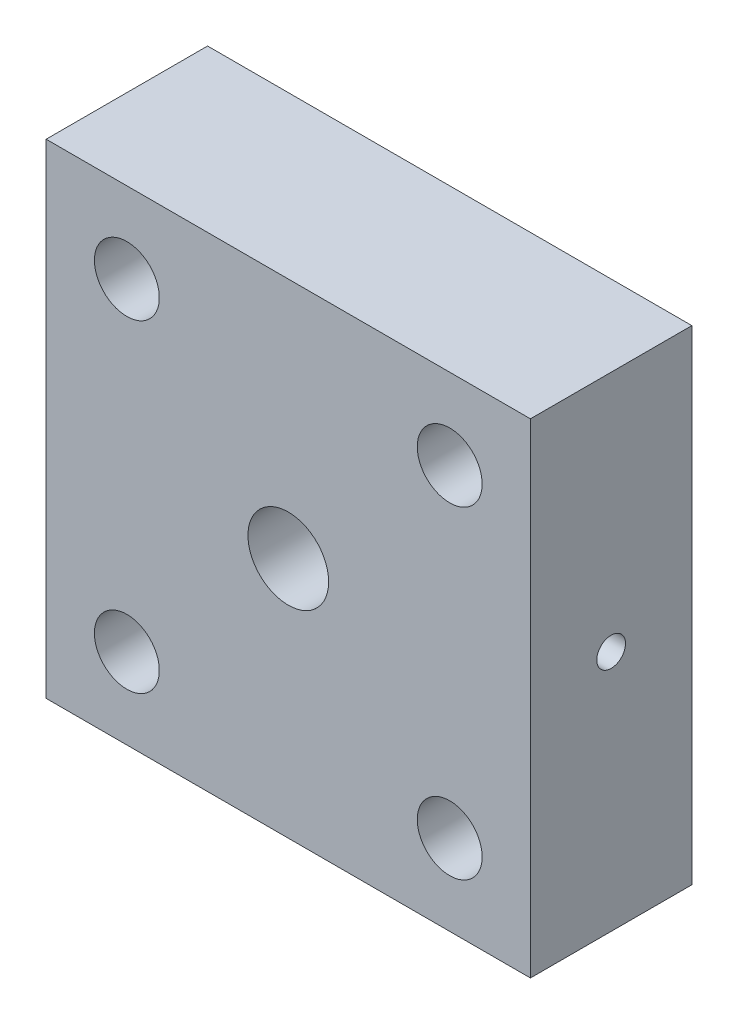
ISO-10303-21;
HEADER;
FILE_DESCRIPTION(('STEP AP214'),'2;1');
FILE_NAME('part.step','',(''),(''),'','','');
FILE_SCHEMA(('AUTOMOTIVE_DESIGN { 1 0 10303 214 1 1 1 1 }'));
ENDSEC;
DATA;
#1=APPLICATION_CONTEXT('core data for automotive mechanical design processes');
#2=APPLICATION_PROTOCOL_DEFINITION('international standard','automotive_design',2000,#1);
#3=PRODUCT_CONTEXT('',#1,'mechanical');
#4=PRODUCT('Part','Part','',(#3));
#5=PRODUCT_RELATED_PRODUCT_CATEGORY('part','',(#4));
#6=PRODUCT_DEFINITION_FORMATION('','',#4);
#7=PRODUCT_DEFINITION_CONTEXT('part definition',#1,'design');
#8=PRODUCT_DEFINITION('design','',#6,#7);
#9=PRODUCT_DEFINITION_SHAPE('','',#8);
#10=(LENGTH_UNIT() NAMED_UNIT(*) SI_UNIT(.MILLI.,.METRE.));
#11=(NAMED_UNIT(*) PLANE_ANGLE_UNIT() SI_UNIT($,.RADIAN.));
#12=(NAMED_UNIT(*) SI_UNIT($,.STERADIAN.) SOLID_ANGLE_UNIT());
#13=UNCERTAINTY_MEASURE_WITH_UNIT(LENGTH_MEASURE(1.E-05),#10,'distance_accuracy_value','');
#14=(GEOMETRIC_REPRESENTATION_CONTEXT(3) GLOBAL_UNCERTAINTY_ASSIGNED_CONTEXT((#13)) GLOBAL_UNIT_ASSIGNED_CONTEXT((#10,
#11,#12)) REPRESENTATION_CONTEXT('',''));
#15=CARTESIAN_POINT('',(0.,0.,0.));
#16=DIRECTION('',(0.,0.,1.));
#17=DIRECTION('',(1.,0.,0.));
#18=AXIS2_PLACEMENT_3D('',#15,#16,#17);
#19=CARTESIAN_POINT('',(0.,0.,12.7));
#20=DIRECTION('',(0.,0.,-1.));
#21=DIRECTION('',(-1.,0.,0.));
#22=AXIS2_PLACEMENT_3D('',#19,#20,#21);
#23=PLANE('',#22);
#24=CARTESIAN_POINT('',(12.7,12.7,12.7));
#25=DIRECTION('',(0.,0.,-1.));
#26=DIRECTION('',(-1.,0.,0.));
#27=AXIS2_PLACEMENT_3D('',#24,#25,#26);
#28=CIRCLE('',#27,2.5527);
#29=CARTESIAN_POINT('',(10.1473,12.7,12.7));
#30=VERTEX_POINT('',#29);
#31=EDGE_CURVE('E268',#30,#30,#28,.T.);
#32=ORIENTED_EDGE('',*,*,#31,.T.);
#33=EDGE_LOOP('',(#32));
#34=FACE_BOUND('',#33,.T.);
#35=CARTESIAN_POINT('',(-12.7,12.7,12.7));
#36=DIRECTION('',(0.,0.,-1.));
#37=DIRECTION('',(-1.,0.,0.));
#38=AXIS2_PLACEMENT_3D('',#35,#36,#37);
#39=CIRCLE('',#38,2.5527);
#40=CARTESIAN_POINT('',(-15.2527,12.7,12.7));
#41=VERTEX_POINT('',#40);
#42=EDGE_CURVE('E262',#41,#41,#39,.T.);
#43=ORIENTED_EDGE('',*,*,#42,.T.);
#44=EDGE_LOOP('',(#43));
#45=FACE_BOUND('',#44,.T.);
#46=CARTESIAN_POINT('',(-12.7,-12.7,12.7));
#47=DIRECTION('',(0.,0.,-1.));
#48=DIRECTION('',(-1.,0.,0.));
#49=AXIS2_PLACEMENT_3D('',#46,#47,#48);
#50=CIRCLE('',#49,2.5527);
#51=CARTESIAN_POINT('',(-15.2527,-12.7,12.7));
#52=VERTEX_POINT('',#51);
#53=EDGE_CURVE('E254',#52,#52,#50,.T.);
#54=ORIENTED_EDGE('',*,*,#53,.T.);
#55=EDGE_LOOP('',(#54));
#56=FACE_BOUND('',#55,.T.);
#57=CARTESIAN_POINT('',(12.7,-12.7,12.7));
#58=DIRECTION('',(0.,0.,-1.));
#59=DIRECTION('',(-1.,0.,0.));
#60=AXIS2_PLACEMENT_3D('',#57,#58,#59);
#61=CIRCLE('',#60,2.5527);
#62=CARTESIAN_POINT('',(10.1473,-12.7,12.7));
#63=VERTEX_POINT('',#62);
#64=EDGE_CURVE('E248',#63,#63,#61,.T.);
#65=ORIENTED_EDGE('',*,*,#64,.T.);
#66=EDGE_LOOP('',(#65));
#67=FACE_BOUND('',#66,.T.);
#68=DIRECTION('',(0.,-1.,0.));
#69=VECTOR('',#68,1.);
#70=CARTESIAN_POINT('',(-19.05,-19.05,12.7));
#71=LINE('',#70,#69);
#72=CARTESIAN_POINT('',(-19.05,19.05,12.7));
#73=VERTEX_POINT('',#72);
#74=CARTESIAN_POINT('',(-19.05,-19.05,12.7));
#75=VERTEX_POINT('',#74);
#76=EDGE_CURVE('E85',#73,#75,#71,.T.);
#77=ORIENTED_EDGE('',*,*,#76,.T.);
#78=DIRECTION('',(1.,0.,0.));
#79=VECTOR('',#78,1.);
#80=CARTESIAN_POINT('',(-19.05,-19.05,12.7));
#81=LINE('',#80,#79);
#82=CARTESIAN_POINT('',(19.05,-19.05,12.7));
#83=VERTEX_POINT('',#82);
#84=EDGE_CURVE('E80',#75,#83,#81,.T.);
#85=ORIENTED_EDGE('',*,*,#84,.T.);
#86=DIRECTION('',(0.,1.,0.));
#87=VECTOR('',#86,1.);
#88=CARTESIAN_POINT('',(19.05,-19.05,12.7));
#89=LINE('',#88,#87);
#90=CARTESIAN_POINT('',(19.05,19.05,12.7));
#91=VERTEX_POINT('',#90);
#92=EDGE_CURVE('E83',#83,#91,#89,.T.);
#93=ORIENTED_EDGE('',*,*,#92,.T.);
#94=DIRECTION('',(-1.,0.,0.));
#95=VECTOR('',#94,1.);
#96=CARTESIAN_POINT('',(-19.05,19.05,12.7));
#97=LINE('',#96,#95);
#98=EDGE_CURVE('E50',#91,#73,#97,.T.);
#99=ORIENTED_EDGE('',*,*,#98,.T.);
#100=EDGE_LOOP('',(#77,#85,#93,#99));
#101=FACE_BOUND('',#100,.T.);
#102=CARTESIAN_POINT('',(0.,0.,12.7));
#103=DIRECTION('',(0.,0.,1.));
#104=DIRECTION('',(1.,0.,0.));
#105=AXIS2_PLACEMENT_3D('',#102,#103,#104);
#106=CIRCLE('',#105,3.175);
#107=CARTESIAN_POINT('',(3.175,0.,12.7));
#108=VERTEX_POINT('',#107);
#109=EDGE_CURVE('E100',#108,#108,#106,.T.);
#110=ORIENTED_EDGE('',*,*,#109,.F.);
#111=EDGE_LOOP('',(#110));
#112=FACE_BOUND('',#111,.T.);
#113=ADVANCED_FACE('F33',(#34,#45,#56,#67,#101,#112),#23,.F.);
#114=CARTESIAN_POINT('',(0.,0.,0.));
#115=DIRECTION('',(0.,0.,-1.));
#116=DIRECTION('',(-1.,0.,0.));
#117=AXIS2_PLACEMENT_3D('',#114,#115,#116);
#118=PLANE('',#117);
#119=CARTESIAN_POINT('',(12.7,12.7,0.));
#120=DIRECTION('',(0.,0.,-1.));
#121=DIRECTION('',(-1.,0.,0.));
#122=AXIS2_PLACEMENT_3D('',#119,#120,#121);
#123=CIRCLE('',#122,2.5527);
#124=CARTESIAN_POINT('',(10.1473,12.7,0.));
#125=VERTEX_POINT('',#124);
#126=EDGE_CURVE('E270',#125,#125,#123,.T.);
#127=ORIENTED_EDGE('',*,*,#126,.F.);
#128=EDGE_LOOP('',(#127));
#129=FACE_BOUND('',#128,.T.);
#130=CARTESIAN_POINT('',(-12.7,12.7,0.));
#131=DIRECTION('',(0.,0.,-1.));
#132=DIRECTION('',(-1.,0.,0.));
#133=AXIS2_PLACEMENT_3D('',#130,#131,#132);
#134=CIRCLE('',#133,2.5527);
#135=CARTESIAN_POINT('',(-15.2527,12.7,0.));
#136=VERTEX_POINT('',#135);
#137=EDGE_CURVE('E265',#136,#136,#134,.T.);
#138=ORIENTED_EDGE('',*,*,#137,.F.);
#139=EDGE_LOOP('',(#138));
#140=FACE_BOUND('',#139,.T.);
#141=CARTESIAN_POINT('',(-12.7,-12.7,0.));
#142=DIRECTION('',(0.,0.,-1.));
#143=DIRECTION('',(-1.,0.,0.));
#144=AXIS2_PLACEMENT_3D('',#141,#142,#143);
#145=CIRCLE('',#144,2.5527);
#146=CARTESIAN_POINT('',(-15.2527,-12.7,0.));
#147=VERTEX_POINT('',#146);
#148=EDGE_CURVE('E259',#147,#147,#145,.T.);
#149=ORIENTED_EDGE('',*,*,#148,.F.);
#150=EDGE_LOOP('',(#149));
#151=FACE_BOUND('',#150,.T.);
#152=CARTESIAN_POINT('',(12.7,-12.7,0.));
#153=DIRECTION('',(0.,0.,-1.));
#154=DIRECTION('',(-1.,0.,0.));
#155=AXIS2_PLACEMENT_3D('',#152,#153,#154);
#156=CIRCLE('',#155,2.5527);
#157=CARTESIAN_POINT('',(10.1473,-12.7,0.));
#158=VERTEX_POINT('',#157);
#159=EDGE_CURVE('E250',#158,#158,#156,.T.);
#160=ORIENTED_EDGE('',*,*,#159,.F.);
#161=EDGE_LOOP('',(#160));
#162=FACE_BOUND('',#161,.T.);
#163=DIRECTION('',(0.,-1.,0.));
#164=VECTOR('',#163,1.);
#165=CARTESIAN_POINT('',(-19.05,-19.05,0.));
#166=LINE('',#165,#164);
#167=CARTESIAN_POINT('',(-19.05,19.05,0.));
#168=VERTEX_POINT('',#167);
#169=CARTESIAN_POINT('',(-19.05,-19.05,0.));
#170=VERTEX_POINT('',#169);
#171=EDGE_CURVE('E97',#168,#170,#166,.T.);
#172=ORIENTED_EDGE('',*,*,#171,.F.);
#173=DIRECTION('',(-1.,0.,0.));
#174=VECTOR('',#173,1.);
#175=CARTESIAN_POINT('',(-19.05,19.05,0.));
#176=LINE('',#175,#174);
#177=CARTESIAN_POINT('',(19.05,19.05,0.));
#178=VERTEX_POINT('',#177);
#179=EDGE_CURVE('E73',#178,#168,#176,.T.);
#180=ORIENTED_EDGE('',*,*,#179,.F.);
#181=DIRECTION('',(0.,1.,0.));
#182=VECTOR('',#181,1.);
#183=CARTESIAN_POINT('',(19.05,-19.05,0.));
#184=LINE('',#183,#182);
#185=CARTESIAN_POINT('',(19.05,-19.05,0.));
#186=VERTEX_POINT('',#185);
#187=EDGE_CURVE('E67',#186,#178,#184,.T.);
#188=ORIENTED_EDGE('',*,*,#187,.F.);
#189=DIRECTION('',(1.,0.,0.));
#190=VECTOR('',#189,1.);
#191=CARTESIAN_POINT('',(-19.05,-19.05,0.));
#192=LINE('',#191,#190);
#193=EDGE_CURVE('E89',#170,#186,#192,.T.);
#194=ORIENTED_EDGE('',*,*,#193,.F.);
#195=EDGE_LOOP('',(#172,#180,#188,#194));
#196=FACE_BOUND('',#195,.T.);
#197=CARTESIAN_POINT('',(0.,0.,0.));
#198=DIRECTION('',(0.,0.,1.));
#199=DIRECTION('',(1.,0.,0.));
#200=AXIS2_PLACEMENT_3D('',#197,#198,#199);
#201=CIRCLE('',#200,3.175);
#202=CARTESIAN_POINT('',(3.175,0.,0.));
#203=VERTEX_POINT('',#202);
#204=EDGE_CURVE('E112',#203,#203,#201,.T.);
#205=ORIENTED_EDGE('',*,*,#204,.T.);
#206=EDGE_LOOP('',(#205));
#207=FACE_BOUND('',#206,.T.);
#208=ADVANCED_FACE('F108',(#129,#140,#151,#162,#196,#207),#118,.T.);
#209=CARTESIAN_POINT('',(-19.05,-19.05,12.7));
#210=DIRECTION('',(1.,0.,0.));
#211=DIRECTION('',(0.,1.,0.));
#212=AXIS2_PLACEMENT_3D('',#209,#210,#211);
#213=PLANE('',#212);
#214=ORIENTED_EDGE('',*,*,#171,.T.);
#215=DIRECTION('',(0.,0.,-1.));
#216=VECTOR('',#215,1.);
#217=CARTESIAN_POINT('',(-19.05,-19.05,12.7));
#218=LINE('',#217,#216);
#219=EDGE_CURVE('E11',#75,#170,#218,.T.);
#220=ORIENTED_EDGE('',*,*,#219,.F.);
#221=ORIENTED_EDGE('',*,*,#76,.F.);
#222=DIRECTION('',(0.,0.,-1.));
#223=VECTOR('',#222,1.);
#224=CARTESIAN_POINT('',(-19.05,19.05,12.7));
#225=LINE('',#224,#223);
#226=EDGE_CURVE('E93',#73,#168,#225,.T.);
#227=ORIENTED_EDGE('',*,*,#226,.T.);
#228=EDGE_LOOP('',(#214,#220,#221,#227));
#229=FACE_BOUND('',#228,.T.);
#230=ADVANCED_FACE('F35',(#229),#213,.F.);
#231=CARTESIAN_POINT('',(-19.05,-19.05,12.7));
#232=DIRECTION('',(0.,1.,0.));
#233=DIRECTION('',(0.,0.,1.));
#234=AXIS2_PLACEMENT_3D('',#231,#232,#233);
#235=PLANE('',#234);
#236=ORIENTED_EDGE('',*,*,#193,.T.);
#237=DIRECTION('',(0.,0.,-1.));
#238=VECTOR('',#237,1.);
#239=CARTESIAN_POINT('',(19.05,-19.05,12.7));
#240=LINE('',#239,#238);
#241=EDGE_CURVE('E42',#83,#186,#240,.T.);
#242=ORIENTED_EDGE('',*,*,#241,.F.);
#243=ORIENTED_EDGE('',*,*,#84,.F.);
#244=ORIENTED_EDGE('',*,*,#219,.T.);
#245=EDGE_LOOP('',(#236,#242,#243,#244));
#246=FACE_BOUND('',#245,.T.);
#247=ADVANCED_FACE('F88',(#246),#235,.F.);
#248=CARTESIAN_POINT('',(19.05,-19.05,12.7));
#249=DIRECTION('',(-1.,0.,0.));
#250=DIRECTION('',(0.,-1.,0.));
#251=AXIS2_PLACEMENT_3D('',#248,#249,#250);
#252=PLANE('',#251);
#253=CARTESIAN_POINT('',(19.05,0.,6.35));
#254=DIRECTION('',(1.,0.,0.));
#255=DIRECTION('',(0.,0.,-1.));
#256=AXIS2_PLACEMENT_3D('',#253,#254,#255);
#257=CIRCLE('',#256,1.13029999999999);
#258=CARTESIAN_POINT('',(19.05,0.,5.21970000000001));
#259=VERTEX_POINT('',#258);
#260=EDGE_CURVE('E124',#259,#259,#257,.T.);
#261=ORIENTED_EDGE('',*,*,#260,.F.);
#262=EDGE_LOOP('',(#261));
#263=FACE_BOUND('',#262,.T.);
#264=ORIENTED_EDGE('',*,*,#187,.T.);
#265=DIRECTION('',(0.,0.,-1.));
#266=VECTOR('',#265,1.);
#267=CARTESIAN_POINT('',(19.05,19.05,12.7));
#268=LINE('',#267,#266);
#269=EDGE_CURVE('E90',#91,#178,#268,.T.);
#270=ORIENTED_EDGE('',*,*,#269,.F.);
#271=ORIENTED_EDGE('',*,*,#92,.F.);
#272=ORIENTED_EDGE('',*,*,#241,.T.);
#273=EDGE_LOOP('',(#264,#270,#271,#272));
#274=FACE_BOUND('',#273,.T.);
#275=ADVANCED_FACE('F91',(#263,#274),#252,.F.);
#276=CARTESIAN_POINT('',(-19.05,19.05,12.7));
#277=DIRECTION('',(0.,-1.,0.));
#278=DIRECTION('',(0.,0.,-1.));
#279=AXIS2_PLACEMENT_3D('',#276,#277,#278);
#280=PLANE('',#279);
#281=ORIENTED_EDGE('',*,*,#179,.T.);
#282=ORIENTED_EDGE('',*,*,#226,.F.);
#283=ORIENTED_EDGE('',*,*,#98,.F.);
#284=ORIENTED_EDGE('',*,*,#269,.T.);
#285=EDGE_LOOP('',(#281,#282,#283,#284));
#286=FACE_BOUND('',#285,.T.);
#287=ADVANCED_FACE('F105',(#286),#280,.F.);
#288=CARTESIAN_POINT('',(0.,0.,12.7));
#289=DIRECTION('',(0.,0.,-1.));
#290=DIRECTION('',(-1.,0.,0.));
#291=AXIS2_PLACEMENT_3D('',#288,#289,#290);
#292=CYLINDRICAL_SURFACE('',#291,3.175);
#293=CARTESIAN_POINT('',(3.175,0.,5.21970000000001));
#294=CARTESIAN_POINT('',(3.17500087649076,-0.0614285544766747,5.21969877624258));
#295=CARTESIAN_POINT('',(3.17320130070143,-0.122848391480884,5.22472367898314));
#296=CARTESIAN_POINT('',(3.1662010034201,-0.243864611742381,5.24461858543575));
#297=CARTESIAN_POINT('',(3.16100038856924,-0.303461052111783,5.25948828045997));
#298=CARTESIAN_POINT('',(3.14775949893737,-0.419068309151042,5.29848844997216));
#299=CARTESIAN_POINT('',(3.13972436624609,-0.475085403185971,5.32260216174167));
#300=CARTESIAN_POINT('',(3.12162393487057,-0.582278041616499,5.37932504012241));
#301=CARTESIAN_POINT('',(3.11155815385673,-0.633452431498646,5.41193622563318));
#302=CARTESIAN_POINT('',(3.09000790855595,-0.731495005230024,5.48605507992649));
#303=CARTESIAN_POINT('',(3.07848610582585,-0.77814961624389,5.52783431689856));
#304=CARTESIAN_POINT('',(3.055516031792,-0.863958107942651,5.61852654130838));
#305=CARTESIAN_POINT('',(3.04406778065305,-0.903110009958683,5.66744140463129));
#306=CARTESIAN_POINT('',(3.02211785986226,-0.974093633832348,5.773025690177));
#307=CARTESIAN_POINT('',(3.01166094904187,-1.00563502809096,5.82990051833327));
#308=CARTESIAN_POINT('',(2.99345244738711,-1.05861134705909,5.94857939759986));
#309=CARTESIAN_POINT('',(2.9856998972079,-1.08004985661478,6.0103816911635));
#310=CARTESIAN_POINT('',(2.9741742173714,-1.11138819305282,6.1347149448491));
#311=CARTESIAN_POINT('',(2.97026214805179,-1.1216923654168,6.1971306997839));
#312=CARTESIAN_POINT('',(2.96645158379257,-1.13173392893204,6.32291847859527));
#313=CARTESIAN_POINT('',(2.96655163468287,-1.13147514856466,6.38629014768161));
#314=CARTESIAN_POINT('',(2.97063328242025,-1.12070953557277,6.5086133661018));
#315=CARTESIAN_POINT('',(2.9744085523292,-1.11074743190181,6.56762097911382));
#316=CARTESIAN_POINT('',(2.98507483987673,-1.08175290027524,6.68306464240935));
#317=CARTESIAN_POINT('',(2.99196628047623,-1.06271924100947,6.73950034245956));
#318=CARTESIAN_POINT('',(3.00822311818093,-1.01579639288464,6.84936762329595));
#319=CARTESIAN_POINT('',(3.01763009039322,-0.987756625641367,6.90272847353732));
#320=CARTESIAN_POINT('',(3.03784253722577,-0.923722187948478,7.00415226072601));
#321=CARTESIAN_POINT('',(3.04864845893998,-0.887724971743373,7.05221349482271));
#322=CARTESIAN_POINT('',(3.0712342285018,-0.806247147627659,7.14471122491127));
#323=CARTESIAN_POINT('',(3.08303358094073,-0.760326653485433,7.18875635543314));
#324=CARTESIAN_POINT('',(3.10571393948941,-0.661610098844961,7.26863040690295));
#325=CARTESIAN_POINT('',(3.11659483086973,-0.608813181467744,7.30445830235303));
#326=CARTESIAN_POINT('',(3.13639217173446,-0.496923650490415,7.36725643876642));
#327=CARTESIAN_POINT('',(3.14528190725224,-0.437759573781152,7.39410836273788));
#328=CARTESIAN_POINT('',(3.15989936928577,-0.315359989841957,7.4373520019204));
#329=CARTESIAN_POINT('',(3.16562835574328,-0.252126116160285,7.45374788553834));
#330=CARTESIAN_POINT('',(3.17306329879329,-0.126684885961712,7.47488948929031));
#331=CARTESIAN_POINT('',(3.17495136824996,-0.0645771816882135,7.48016304433809));
#332=CARTESIAN_POINT('',(3.17504672531149,0.0596565359676988,7.48043160042332));
#333=CARTESIAN_POINT('',(3.1732547352019,0.121782543364874,7.47542861843736));
#334=CARTESIAN_POINT('',(3.16631168752833,0.242087689559502,7.45569555255756));
#335=CARTESIAN_POINT('',(3.16127656517542,0.300329231110411,7.44130097687732));
#336=CARTESIAN_POINT('',(3.14846933320479,0.413538192846499,7.40362458392996));
#337=CARTESIAN_POINT('',(3.14069686838655,0.468505187040127,7.38034161326216));
#338=CARTESIAN_POINT('',(3.12292068057346,0.575332725471092,7.32483109763225));
#339=CARTESIAN_POINT('',(3.11286035066926,0.627062417893483,7.29237039982098));
#340=CARTESIAN_POINT('',(3.09163517782237,0.724505279210261,7.21969392625775));
#341=CARTESIAN_POINT('',(3.08046995852104,0.770216385550681,7.17947550353221));
#342=CARTESIAN_POINT('',(3.05754963314883,0.856811848575497,7.08995158635895));
#343=CARTESIAN_POINT('',(3.0457941243994,0.897320261231918,7.04028162488484));
#344=CARTESIAN_POINT('',(3.02359841598846,0.969488296473172,6.93460588734371));
#345=CARTESIAN_POINT('',(3.01315827754058,1.00114750732455,6.87859981664202));
#346=CARTESIAN_POINT('',(2.99485112677041,1.05465477079429,6.76160726309193));
#347=CARTESIAN_POINT('',(2.98698641696941,1.07649405053023,6.70061638418745));
#348=CARTESIAN_POINT('',(2.97489781303426,1.1094694490286,6.57547036605966));
#349=CARTESIAN_POINT('',(2.97067196334806,1.12061131703489,6.51131694603455));
#350=CARTESIAN_POINT('',(2.96658222044346,1.13139068963521,6.38569434395218));
#351=CARTESIAN_POINT('',(2.9664783574786,1.13166111008653,6.32428675952382));
#352=CARTESIAN_POINT('',(2.97003931415379,1.12228164306422,6.20235111764559));
#353=CARTESIAN_POINT('',(2.97370384428697,1.1126325176599,6.14182299299347));
#354=CARTESIAN_POINT('',(2.98419839475885,1.08416089230554,6.02487294880746));
#355=CARTESIAN_POINT('',(2.9909477964968,1.06557142470546,5.96838646868559));
#356=CARTESIAN_POINT('',(3.0068123311106,1.01994372799953,5.85929540767603));
#357=CARTESIAN_POINT('',(3.01592803119462,0.992903472899543,5.80669176140234));
#358=CARTESIAN_POINT('',(3.03604854272464,0.929616151238458,5.70409051132457));
#359=CARTESIAN_POINT('',(3.0471235224069,0.892986233526772,5.6543429511517));
#360=CARTESIAN_POINT('',(3.06964995874745,0.812177154252533,5.56149729256409));
#361=CARTESIAN_POINT('',(3.08110152803636,0.767995717285475,5.51840120582447));
#362=CARTESIAN_POINT('',(3.10373428576573,0.670861718733727,5.43803642120086));
#363=CARTESIAN_POINT('',(3.11487776157142,0.617595515492277,5.40113466782598));
#364=CARTESIAN_POINT('',(3.13506244460878,0.505234578584046,5.33683451178947));
#365=CARTESIAN_POINT('',(3.14410383031939,0.446140340356564,5.30943530221262));
#366=CARTESIAN_POINT('',(3.15906443826106,0.32364519702785,5.26506649917454));
#367=CARTESIAN_POINT('',(3.16497811106267,0.260236860921376,5.24811543486654));
#368=CARTESIAN_POINT('',(3.17294468299437,0.131215131612622,5.22543499228508));
#369=CARTESIAN_POINT('',(3.17499906395212,0.0656025945972269,5.21970130691115));
#370=CARTESIAN_POINT('',(3.175,0.,5.21970000000001));
#371=B_SPLINE_CURVE_WITH_KNOTS('',3,(#293,#294,#295,#296,#297,#298,#299,#300,#301,#302,#303,
#304,#305,#306,#307,#308,#309,#310,#311,#312,#313,#314,#315,#316,#317,#318,#319,#320,#321,#322,
#323,#324,#325,#326,#327,#328,#329,#330,#331,#332,#333,#334,#335,#336,#337,#338,#339,#340,#341,
#342,#343,#344,#345,#346,#347,#348,#349,#350,#351,#352,#353,#354,#355,#356,#357,#358,#359,#360,
#361,#362,#363,#364,#365,#366,#367,#368,#369,#370),.UNSPECIFIED.,.T.,.F.,(4,2,2,2,2,2,2,2,2,2,2,
2,2,2,2,2,2,2,2,2,2,2,2,2,2,2,2,2,2,2,2,2,2,2,2,2,2,2,4),(0.,0.184043941459559,
0.368082112412803,0.551788122807079,0.735537819443362,0.925722644883199,1.11595755842548,
1.31258758821647,1.50914779437034,1.69830149435245,1.88738663727474,2.0664345293368,
2.24550673104464,2.42774410221585,2.61003985955345,2.80329006106035,2.99656436677722,
3.19229416831943,3.38794589132548,3.57408187032766,3.76018131989988,3.93997181359126,
4.11978564569257,4.30465683345393,4.48959121210526,4.68416822385533,4.87875428732967,
5.07351384543875,5.26816867279113,5.45147357003615,5.634764385931,5.81351722268546,
5.99231294661072,6.17977826003497,6.36730015993198,6.56359488860401,6.7598729446871,
6.95649809396627,7.15304773089824),.UNSPECIFIED.);
#372=CARTESIAN_POINT('',(3.175,0.,5.21970000000001));
#373=VERTEX_POINT('',#372);
#374=EDGE_CURVE('E115',#373,#373,#371,.T.);
#375=ORIENTED_EDGE('',*,*,#374,.F.);
#376=EDGE_LOOP('',(#375));
#377=FACE_BOUND('',#376,.T.);
#378=ORIENTED_EDGE('',*,*,#109,.T.);
#379=EDGE_LOOP('',(#378));
#380=FACE_BOUND('',#379,.T.);
#381=ORIENTED_EDGE('',*,*,#204,.F.);
#382=EDGE_LOOP('',(#381));
#383=FACE_BOUND('',#382,.T.);
#384=ADVANCED_FACE('F133',(#377,#380,#383),#292,.F.);
#385=CARTESIAN_POINT('',(19.05,0.,6.35));
#386=DIRECTION('',(1.,0.,0.));
#387=DIRECTION('',(0.,0.,-1.));
#388=AXIS2_PLACEMENT_3D('',#385,#386,#387);
#389=CYLINDRICAL_SURFACE('',#388,1.13029999999999);
#390=ORIENTED_EDGE('',*,*,#260,.T.);
#391=EDGE_LOOP('',(#390));
#392=FACE_BOUND('',#391,.T.);
#393=ORIENTED_EDGE('',*,*,#374,.T.);
#394=EDGE_LOOP('',(#393));
#395=FACE_BOUND('',#394,.T.);
#396=ADVANCED_FACE('F128',(#392,#395),#389,.F.);
#397=CARTESIAN_POINT('',(12.7,-12.7,0.));
#398=DIRECTION('',(0.,0.,-1.));
#399=DIRECTION('',(-1.,0.,0.));
#400=AXIS2_PLACEMENT_3D('',#397,#398,#399);
#401=CYLINDRICAL_SURFACE('',#400,2.5527);
#402=ORIENTED_EDGE('',*,*,#64,.F.);
#403=EDGE_LOOP('',(#402));
#404=FACE_BOUND('',#403,.T.);
#405=ORIENTED_EDGE('',*,*,#159,.T.);
#406=EDGE_LOOP('',(#405));
#407=FACE_BOUND('',#406,.T.);
#408=ADVANCED_FACE('F132',(#404,#407),#401,.F.);
#409=CARTESIAN_POINT('',(-12.7,-12.7,0.));
#410=DIRECTION('',(0.,0.,-1.));
#411=DIRECTION('',(-1.,0.,0.));
#412=AXIS2_PLACEMENT_3D('',#409,#410,#411);
#413=CYLINDRICAL_SURFACE('',#412,2.5527);
#414=ORIENTED_EDGE('',*,*,#53,.F.);
#415=EDGE_LOOP('',(#414));
#416=FACE_BOUND('',#415,.T.);
#417=ORIENTED_EDGE('',*,*,#148,.T.);
#418=EDGE_LOOP('',(#417));
#419=FACE_BOUND('',#418,.T.);
#420=ADVANCED_FACE('F137',(#416,#419),#413,.F.);
#421=CARTESIAN_POINT('',(-12.7,12.7,0.));
#422=DIRECTION('',(0.,0.,-1.));
#423=DIRECTION('',(-1.,0.,0.));
#424=AXIS2_PLACEMENT_3D('',#421,#422,#423);
#425=CYLINDRICAL_SURFACE('',#424,2.5527);
#426=ORIENTED_EDGE('',*,*,#42,.F.);
#427=EDGE_LOOP('',(#426));
#428=FACE_BOUND('',#427,.T.);
#429=ORIENTED_EDGE('',*,*,#137,.T.);
#430=EDGE_LOOP('',(#429));
#431=FACE_BOUND('',#430,.T.);
#432=ADVANCED_FACE('F141',(#428,#431),#425,.F.);
#433=CARTESIAN_POINT('',(12.7,12.7,0.));
#434=DIRECTION('',(0.,0.,-1.));
#435=DIRECTION('',(-1.,0.,0.));
#436=AXIS2_PLACEMENT_3D('',#433,#434,#435);
#437=CYLINDRICAL_SURFACE('',#436,2.5527);
#438=ORIENTED_EDGE('',*,*,#31,.F.);
#439=EDGE_LOOP('',(#438));
#440=FACE_BOUND('',#439,.T.);
#441=ORIENTED_EDGE('',*,*,#126,.T.);
#442=EDGE_LOOP('',(#441));
#443=FACE_BOUND('',#442,.T.);
#444=ADVANCED_FACE('F145',(#440,#443),#437,.F.);
#445=CLOSED_SHELL('',(#113,#208,#230,#247,#275,#287,#384,#396,#408,#420,#432,#444));
#446=MANIFOLD_SOLID_BREP('B2',#445);
#447=ADVANCED_BREP_SHAPE_REPRESENTATION('',(#18,#446),#14);
#448=SHAPE_DEFINITION_REPRESENTATION(#9,#447);
ENDSEC;
END-ISO-10303-21;
